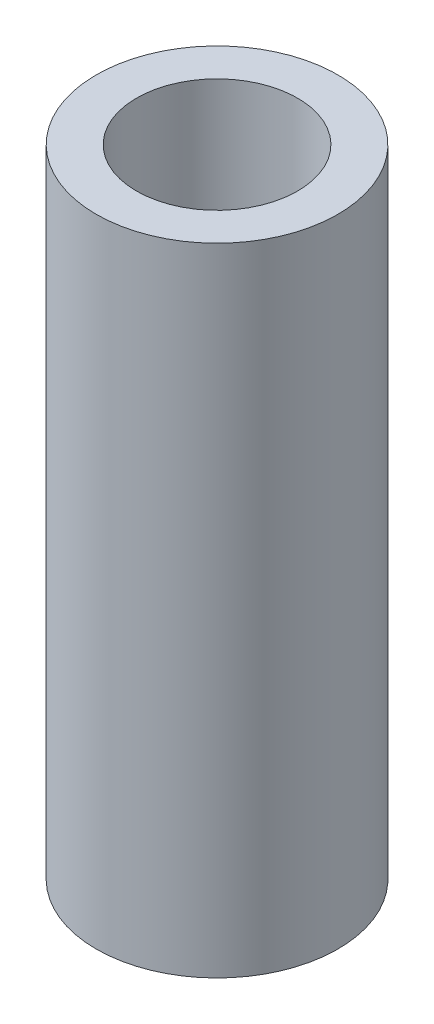
ISO-10303-21;
HEADER;
FILE_DESCRIPTION(('STEP AP214'),'2;1');
FILE_NAME('part.step','',(''),(''),'','','');
FILE_SCHEMA(('AUTOMOTIVE_DESIGN { 1 0 10303 214 1 1 1 1 }'));
ENDSEC;
DATA;
#1=APPLICATION_CONTEXT('core data for automotive mechanical design processes');
#2=APPLICATION_PROTOCOL_DEFINITION('international standard','automotive_design',2000,#1);
#3=PRODUCT_CONTEXT('',#1,'mechanical');
#4=PRODUCT('Part','Part','',(#3));
#5=PRODUCT_RELATED_PRODUCT_CATEGORY('part','',(#4));
#6=PRODUCT_DEFINITION_FORMATION('','',#4);
#7=PRODUCT_DEFINITION_CONTEXT('part definition',#1,'design');
#8=PRODUCT_DEFINITION('design','',#6,#7);
#9=PRODUCT_DEFINITION_SHAPE('','',#8);
#10=(LENGTH_UNIT() NAMED_UNIT(*) SI_UNIT(.MILLI.,.METRE.));
#11=(NAMED_UNIT(*) PLANE_ANGLE_UNIT() SI_UNIT($,.RADIAN.));
#12=(NAMED_UNIT(*) SI_UNIT($,.STERADIAN.) SOLID_ANGLE_UNIT());
#13=UNCERTAINTY_MEASURE_WITH_UNIT(LENGTH_MEASURE(1.E-05),#10,'distance_accuracy_value','');
#14=(GEOMETRIC_REPRESENTATION_CONTEXT(3) GLOBAL_UNCERTAINTY_ASSIGNED_CONTEXT((#13)) GLOBAL_UNIT_ASSIGNED_CONTEXT((#10,
#11,#12)) REPRESENTATION_CONTEXT('',''));
#15=CARTESIAN_POINT('',(0.,0.,0.));
#16=DIRECTION('',(0.,0.,1.));
#17=DIRECTION('',(1.,0.,0.));
#18=AXIS2_PLACEMENT_3D('',#15,#16,#17);
#19=CARTESIAN_POINT('',(0.,39.5,0.));
#20=DIRECTION('',(0.,1.,0.));
#21=DIRECTION('',(0.,0.,1.));
#22=AXIS2_PLACEMENT_3D('',#19,#20,#21);
#23=PLANE('',#22);
#24=CARTESIAN_POINT('',(0.,39.5,0.));
#25=DIRECTION('',(0.,1.,0.));
#26=DIRECTION('',(0.,0.,1.));
#27=AXIS2_PLACEMENT_3D('',#24,#25,#26);
#28=CIRCLE('',#27,7.5);
#29=CARTESIAN_POINT('',(0.,39.5,7.5));
#30=VERTEX_POINT('',#29);
#31=EDGE_CURVE('E10',#30,#30,#28,.T.);
#32=ORIENTED_EDGE('',*,*,#31,.T.);
#33=EDGE_LOOP('',(#32));
#34=FACE_BOUND('',#33,.T.);
#35=CARTESIAN_POINT('',(0.,39.5,0.));
#36=DIRECTION('',(0.,1.,0.));
#37=DIRECTION('',(0.,0.,1.));
#38=AXIS2_PLACEMENT_3D('',#35,#36,#37);
#39=CIRCLE('',#38,5.);
#40=CARTESIAN_POINT('',(0.,39.5,5.));
#41=VERTEX_POINT('',#40);
#42=EDGE_CURVE('E50',#41,#41,#39,.T.);
#43=ORIENTED_EDGE('',*,*,#42,.F.);
#44=EDGE_LOOP('',(#43));
#45=FACE_BOUND('',#44,.T.);
#46=ADVANCED_FACE('F37',(#34,#45),#23,.T.);
#47=CARTESIAN_POINT('',(0.,0.,0.));
#48=DIRECTION('',(0.,1.,0.));
#49=DIRECTION('',(0.,0.,1.));
#50=AXIS2_PLACEMENT_3D('',#47,#48,#49);
#51=PLANE('',#50);
#52=CARTESIAN_POINT('',(0.,0.,0.));
#53=DIRECTION('',(0.,1.,0.));
#54=DIRECTION('',(0.,0.,1.));
#55=AXIS2_PLACEMENT_3D('',#52,#53,#54);
#56=CIRCLE('',#55,7.5);
#57=CARTESIAN_POINT('',(0.,0.,7.5));
#58=VERTEX_POINT('',#57);
#59=EDGE_CURVE('E41',#58,#58,#56,.T.);
#60=ORIENTED_EDGE('',*,*,#59,.F.);
#61=EDGE_LOOP('',(#60));
#62=FACE_BOUND('',#61,.T.);
#63=CARTESIAN_POINT('',(0.,0.,0.));
#64=DIRECTION('',(0.,1.,0.));
#65=DIRECTION('',(0.,0.,1.));
#66=AXIS2_PLACEMENT_3D('',#63,#64,#65);
#67=CIRCLE('',#66,5.);
#68=CARTESIAN_POINT('',(0.,0.,5.));
#69=VERTEX_POINT('',#68);
#70=EDGE_CURVE('E52',#69,#69,#67,.T.);
#71=ORIENTED_EDGE('',*,*,#70,.T.);
#72=EDGE_LOOP('',(#71));
#73=FACE_BOUND('',#72,.T.);
#74=ADVANCED_FACE('F64',(#62,#73),#51,.F.);
#75=CARTESIAN_POINT('',(0.,39.5,0.));
#76=DIRECTION('',(0.,-1.,0.));
#77=DIRECTION('',(0.,0.,-1.));
#78=AXIS2_PLACEMENT_3D('',#75,#76,#77);
#79=CYLINDRICAL_SURFACE('',#78,7.5);
#80=ORIENTED_EDGE('',*,*,#31,.F.);
#81=EDGE_LOOP('',(#80));
#82=FACE_BOUND('',#81,.T.);
#83=ORIENTED_EDGE('',*,*,#59,.T.);
#84=EDGE_LOOP('',(#83));
#85=FACE_BOUND('',#84,.T.);
#86=ADVANCED_FACE('F39',(#82,#85),#79,.T.);
#87=CARTESIAN_POINT('',(0.,39.5,0.));
#88=DIRECTION('',(0.,-1.,0.));
#89=DIRECTION('',(0.,0.,-1.));
#90=AXIS2_PLACEMENT_3D('',#87,#88,#89);
#91=CYLINDRICAL_SURFACE('',#90,5.);
#92=ORIENTED_EDGE('',*,*,#42,.T.);
#93=EDGE_LOOP('',(#92));
#94=FACE_BOUND('',#93,.T.);
#95=ORIENTED_EDGE('',*,*,#70,.F.);
#96=EDGE_LOOP('',(#95));
#97=FACE_BOUND('',#96,.T.);
#98=ADVANCED_FACE('F60',(#94,#97),#91,.F.);
#99=CLOSED_SHELL('',(#46,#74,#86,#98));
#100=MANIFOLD_SOLID_BREP('B2',#99);
#101=ADVANCED_BREP_SHAPE_REPRESENTATION('',(#18,#100),#14);
#102=SHAPE_DEFINITION_REPRESENTATION(#9,#101);
ENDSEC;
END-ISO-10303-21;
